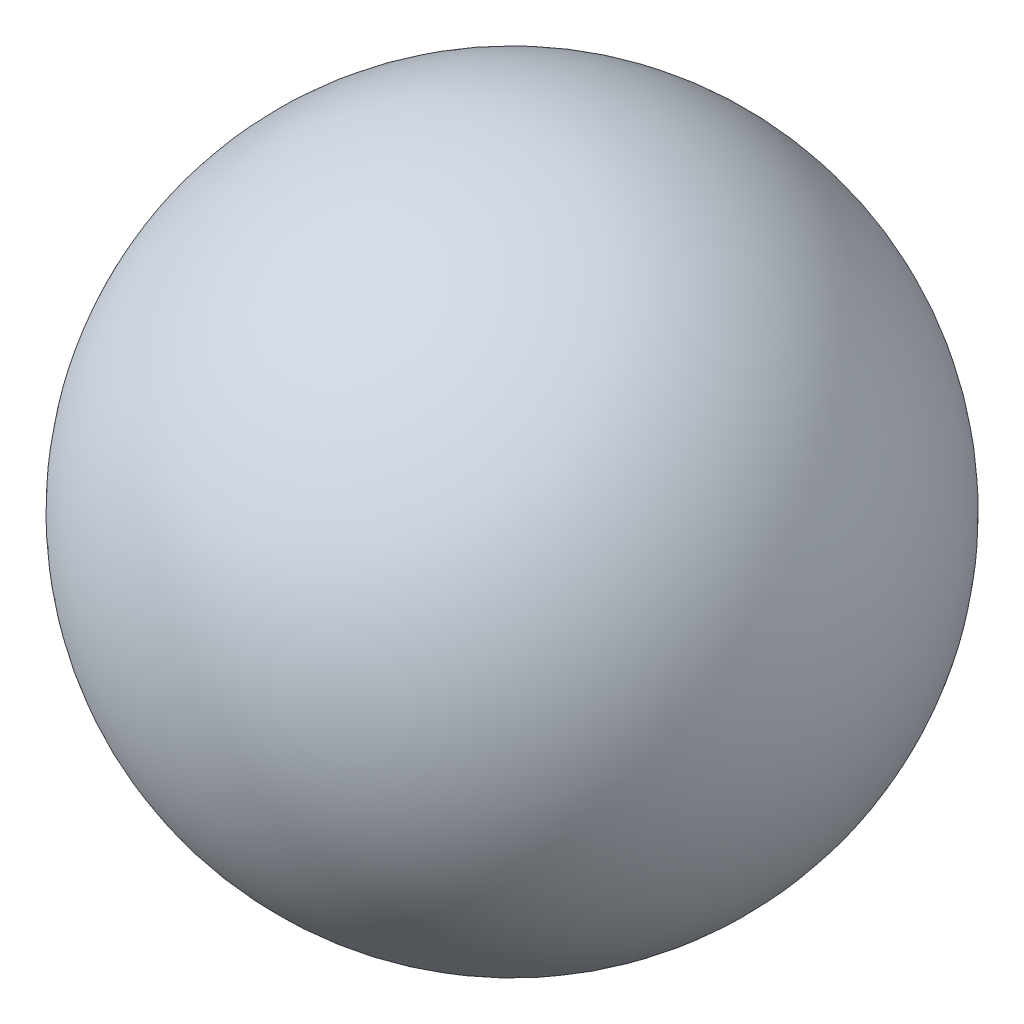
ISO-10303-21;
HEADER;
FILE_DESCRIPTION(('STEP AP214'),'2;1');
FILE_NAME('part.step','',(''),(''),'','','');
FILE_SCHEMA(('AUTOMOTIVE_DESIGN { 1 0 10303 214 1 1 1 1 }'));
ENDSEC;
DATA;
#1=APPLICATION_CONTEXT('core data for automotive mechanical design processes');
#2=APPLICATION_PROTOCOL_DEFINITION('international standard','automotive_design',2000,#1);
#3=PRODUCT_CONTEXT('',#1,'mechanical');
#4=PRODUCT('Part','Part','',(#3));
#5=PRODUCT_RELATED_PRODUCT_CATEGORY('part','',(#4));
#6=PRODUCT_DEFINITION_FORMATION('','',#4);
#7=PRODUCT_DEFINITION_CONTEXT('part definition',#1,'design');
#8=PRODUCT_DEFINITION('design','',#6,#7);
#9=PRODUCT_DEFINITION_SHAPE('','',#8);
#10=(LENGTH_UNIT() NAMED_UNIT(*) SI_UNIT(.MILLI.,.METRE.));
#11=(NAMED_UNIT(*) PLANE_ANGLE_UNIT() SI_UNIT($,.RADIAN.));
#12=(NAMED_UNIT(*) SI_UNIT($,.STERADIAN.) SOLID_ANGLE_UNIT());
#13=UNCERTAINTY_MEASURE_WITH_UNIT(LENGTH_MEASURE(1.E-05),#10,'distance_accuracy_value','');
#14=(GEOMETRIC_REPRESENTATION_CONTEXT(3) GLOBAL_UNCERTAINTY_ASSIGNED_CONTEXT((#13)) GLOBAL_UNIT_ASSIGNED_CONTEXT((#10,
#11,#12)) REPRESENTATION_CONTEXT('',''));
#15=CARTESIAN_POINT('',(0.,0.,0.));
#16=DIRECTION('',(0.,0.,1.));
#17=DIRECTION('',(1.,0.,0.));
#18=AXIS2_PLACEMENT_3D('',#15,#16,#17);
#19=CARTESIAN_POINT('',(0.,0.,0.));
#20=DIRECTION('',(1.,0.,0.));
#21=DIRECTION('',(0.,-1.,0.));
#22=AXIS2_PLACEMENT_3D('',#19,#20,#21);
#23=SPHERICAL_SURFACE('',#22,43.87524536538);
#24=CARTESIAN_POINT('',(43.87524536538,0.,0.));
#25=VERTEX_POINT('',#24);
#26=VERTEX_LOOP('',#25);
#27=FACE_BOUND('',#26,.T.);
#28=ADVANCED_FACE('F41',(#27),#23,.T.);
#29=CLOSED_SHELL('',(#28));
#30=MANIFOLD_SOLID_BREP('B2',#29);
#31=ADVANCED_BREP_SHAPE_REPRESENTATION('',(#18,#30),#14);
#32=SHAPE_DEFINITION_REPRESENTATION(#9,#31);
ENDSEC;
END-ISO-10303-21;
